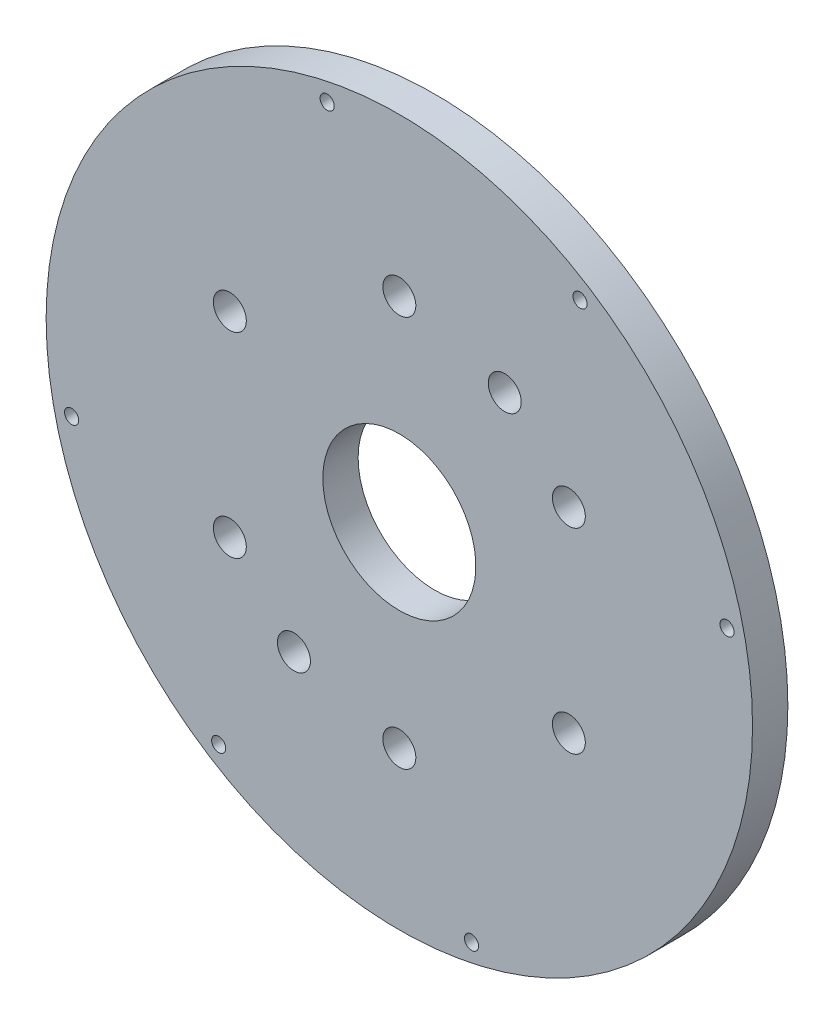
ISO-10303-21;
HEADER;
FILE_DESCRIPTION(('STEP AP214'),'2;1');
FILE_NAME('part.step','',(''),(''),'','','');
FILE_SCHEMA(('AUTOMOTIVE_DESIGN { 1 0 10303 214 1 1 1 1 }'));
ENDSEC;
DATA;
#1=APPLICATION_CONTEXT('core data for automotive mechanical design processes');
#2=APPLICATION_PROTOCOL_DEFINITION('international standard','automotive_design',2000,#1);
#3=PRODUCT_CONTEXT('',#1,'mechanical');
#4=PRODUCT('Part','Part','',(#3));
#5=PRODUCT_RELATED_PRODUCT_CATEGORY('part','',(#4));
#6=PRODUCT_DEFINITION_FORMATION('','',#4);
#7=PRODUCT_DEFINITION_CONTEXT('part definition',#1,'design');
#8=PRODUCT_DEFINITION('design','',#6,#7);
#9=PRODUCT_DEFINITION_SHAPE('','',#8);
#10=(LENGTH_UNIT() NAMED_UNIT(*) SI_UNIT(.MILLI.,.METRE.));
#11=(NAMED_UNIT(*) PLANE_ANGLE_UNIT() SI_UNIT($,.RADIAN.));
#12=(NAMED_UNIT(*) SI_UNIT($,.STERADIAN.) SOLID_ANGLE_UNIT());
#13=UNCERTAINTY_MEASURE_WITH_UNIT(LENGTH_MEASURE(1.E-05),#10,'distance_accuracy_value','');
#14=(GEOMETRIC_REPRESENTATION_CONTEXT(3) GLOBAL_UNCERTAINTY_ASSIGNED_CONTEXT((#13)) GLOBAL_UNIT_ASSIGNED_CONTEXT((#10,
#11,#12)) REPRESENTATION_CONTEXT('',''));
#15=CARTESIAN_POINT('',(0.,0.,0.));
#16=DIRECTION('',(0.,0.,1.));
#17=DIRECTION('',(1.,0.,0.));
#18=AXIS2_PLACEMENT_3D('',#15,#16,#17);
#19=CARTESIAN_POINT('',(0.,0.,-6.));
#20=DIRECTION('',(0.,0.,1.));
#21=DIRECTION('',(1.,0.,0.));
#22=AXIS2_PLACEMENT_3D('',#19,#20,#21);
#23=CYLINDRICAL_SURFACE('',#22,60.);
#24=CARTESIAN_POINT('',(0.,0.,-6.));
#25=DIRECTION('',(0.,0.,1.));
#26=DIRECTION('',(1.,0.,0.));
#27=AXIS2_PLACEMENT_3D('',#24,#25,#26);
#28=CIRCLE('',#27,60.);
#29=CARTESIAN_POINT('',(60.,0.,-6.));
#30=VERTEX_POINT('',#29);
#31=EDGE_CURVE('E10',#30,#30,#28,.T.);
#32=ORIENTED_EDGE('',*,*,#31,.T.);
#33=EDGE_LOOP('',(#32));
#34=FACE_BOUND('',#33,.T.);
#35=CARTESIAN_POINT('',(0.,0.,0.));
#36=DIRECTION('',(0.,0.,1.));
#37=DIRECTION('',(1.,0.,0.));
#38=AXIS2_PLACEMENT_3D('',#35,#36,#37);
#39=CIRCLE('',#38,60.);
#40=CARTESIAN_POINT('',(60.,0.,0.));
#41=VERTEX_POINT('',#40);
#42=EDGE_CURVE('E43',#41,#41,#39,.T.);
#43=ORIENTED_EDGE('',*,*,#42,.F.);
#44=EDGE_LOOP('',(#43));
#45=FACE_BOUND('',#44,.T.);
#46=ADVANCED_FACE('F40',(#34,#45),#23,.T.);
#47=CARTESIAN_POINT('',(0.,0.,-6.));
#48=DIRECTION('',(0.,0.,1.));
#49=DIRECTION('',(1.,0.,0.));
#50=AXIS2_PLACEMENT_3D('',#47,#48,#49);
#51=PLANE('',#50);
#52=CARTESIAN_POINT('',(55.665534128586,12.2616601722212,-6.));
#53=DIRECTION('',(0.,0.,-1.));
#54=DIRECTION('',(-1.,0.,0.));
#55=AXIS2_PLACEMENT_3D('',#52,#53,#54);
#56=CIRCLE('',#55,2.19999999999999);
#57=CARTESIAN_POINT('',(53.465534128586,12.2616601722212,-6.));
#58=VERTEX_POINT('',#57);
#59=EDGE_CURVE('E174',#58,#58,#56,.T.);
#60=ORIENTED_EDGE('',*,*,#59,.F.);
#61=EDGE_LOOP('',(#60));
#62=FACE_BOUND('',#61,.T.);
#63=CARTESIAN_POINT('',(30.691173604312,48.0317797170788,-6.));
#64=DIRECTION('',(0.,0.,-1.));
#65=DIRECTION('',(-1.,0.,0.));
#66=AXIS2_PLACEMENT_3D('',#63,#64,#65);
#67=CIRCLE('',#66,2.2);
#68=CARTESIAN_POINT('',(28.491173604312,48.0317797170788,-6.));
#69=VERTEX_POINT('',#68);
#70=EDGE_CURVE('E162',#69,#69,#67,.T.);
#71=ORIENTED_EDGE('',*,*,#70,.F.);
#72=EDGE_LOOP('',(#71));
#73=FACE_BOUND('',#72,.T.);
#74=CARTESIAN_POINT('',(-12.261660172222,55.6655341285893,-6.));
#75=DIRECTION('',(0.,0.,-1.));
#76=DIRECTION('',(-1.,0.,0.));
#77=AXIS2_PLACEMENT_3D('',#74,#75,#76);
#78=CIRCLE('',#77,2.19999999999999);
#79=CARTESIAN_POINT('',(-14.461660172222,55.6655341285893,-6.));
#80=VERTEX_POINT('',#79);
#81=EDGE_CURVE('E150',#80,#80,#78,.T.);
#82=ORIENTED_EDGE('',*,*,#81,.F.);
#83=EDGE_LOOP('',(#82));
#84=FACE_BOUND('',#83,.T.);
#85=CARTESIAN_POINT('',(-55.6655341285901,-12.2616601722186,-6.));
#86=DIRECTION('',(0.,0.,-1.));
#87=DIRECTION('',(-1.,0.,0.));
#88=AXIS2_PLACEMENT_3D('',#85,#86,#87);
#89=CIRCLE('',#88,2.19999999999999);
#90=CARTESIAN_POINT('',(-57.8655341285901,-12.2616601722186,-6.));
#91=VERTEX_POINT('',#90);
#92=EDGE_CURVE('E138',#91,#91,#89,.T.);
#93=ORIENTED_EDGE('',*,*,#92,.F.);
#94=EDGE_LOOP('',(#93));
#95=FACE_BOUND('',#94,.T.);
#96=CARTESIAN_POINT('',(-30.6911736043161,-48.0317797170762,-6.));
#97=DIRECTION('',(0.,0.,-1.));
#98=DIRECTION('',(-1.,0.,0.));
#99=AXIS2_PLACEMENT_3D('',#96,#97,#98);
#100=CIRCLE('',#99,2.19999999999999);
#101=CARTESIAN_POINT('',(-32.8911736043161,-48.0317797170762,-6.));
#102=VERTEX_POINT('',#101);
#103=EDGE_CURVE('E126',#102,#102,#100,.T.);
#104=ORIENTED_EDGE('',*,*,#103,.F.);
#105=EDGE_LOOP('',(#104));
#106=FACE_BOUND('',#105,.T.);
#107=CARTESIAN_POINT('',(12.2616601722178,-55.6655341285867,-6.));
#108=DIRECTION('',(0.,0.,-1.));
#109=DIRECTION('',(-1.,0.,0.));
#110=AXIS2_PLACEMENT_3D('',#107,#108,#109);
#111=CIRCLE('',#110,2.19999999999999);
#112=CARTESIAN_POINT('',(10.0616601722179,-55.6655341285867,-6.));
#113=VERTEX_POINT('',#112);
#114=EDGE_CURVE('E114',#113,#113,#111,.T.);
#115=ORIENTED_EDGE('',*,*,#114,.F.);
#116=EDGE_LOOP('',(#115));
#117=FACE_BOUND('',#116,.T.);
#118=CARTESIAN_POINT('',(17.9031846025153,28.018538168296,-6.));
#119=DIRECTION('',(0.,0.,1.));
#120=DIRECTION('',(1.,0.,0.));
#121=AXIS2_PLACEMENT_3D('',#118,#119,#120);
#122=CIRCLE('',#121,2.8);
#123=CARTESIAN_POINT('',(20.7031846025153,28.018538168296,-6.));
#124=VERTEX_POINT('',#123);
#125=EDGE_CURVE('E99',#124,#124,#122,.T.);
#126=ORIENTED_EDGE('',*,*,#125,.T.);
#127=EDGE_LOOP('',(#126));
#128=FACE_BOUND('',#127,.T.);
#129=CARTESIAN_POINT('',(-17.9031846025153,-28.018538168296,-6.));
#130=DIRECTION('',(0.,0.,1.));
#131=DIRECTION('',(1.,0.,0.));
#132=AXIS2_PLACEMENT_3D('',#129,#130,#131);
#133=CIRCLE('',#132,2.8);
#134=CARTESIAN_POINT('',(-15.1031846025153,-28.018538168296,-6.));
#135=VERTEX_POINT('',#134);
#136=EDGE_CURVE('E93',#135,#135,#133,.T.);
#137=ORIENTED_EDGE('',*,*,#136,.T.);
#138=EDGE_LOOP('',(#137));
#139=FACE_BOUND('',#138,.T.);
#140=CARTESIAN_POINT('',(0.,-33.25,-6.));
#141=DIRECTION('',(0.,0.,-1.));
#142=DIRECTION('',(-1.,0.,0.));
#143=AXIS2_PLACEMENT_3D('',#140,#141,#142);
#144=CIRCLE('',#143,2.8);
#145=CARTESIAN_POINT('',(-2.8,-33.25,-6.));
#146=VERTEX_POINT('',#145);
#147=EDGE_CURVE('E90',#146,#146,#144,.T.);
#148=ORIENTED_EDGE('',*,*,#147,.F.);
#149=EDGE_LOOP('',(#148));
#150=FACE_BOUND('',#149,.T.);
#151=CARTESIAN_POINT('',(28.7953446758326,-16.6249999999999,-6.));
#152=DIRECTION('',(0.,0.,-1.));
#153=DIRECTION('',(-1.,0.,0.));
#154=AXIS2_PLACEMENT_3D('',#151,#152,#153);
#155=CIRCLE('',#154,2.8);
#156=CARTESIAN_POINT('',(25.9953446758326,-16.6249999999999,-6.));
#157=VERTEX_POINT('',#156);
#158=EDGE_CURVE('E84',#157,#157,#155,.T.);
#159=ORIENTED_EDGE('',*,*,#158,.F.);
#160=EDGE_LOOP('',(#159));
#161=FACE_BOUND('',#160,.T.);
#162=CARTESIAN_POINT('',(28.7953446758325,16.6250000000001,-6.));
#163=DIRECTION('',(0.,0.,-1.));
#164=DIRECTION('',(-1.,0.,0.));
#165=AXIS2_PLACEMENT_3D('',#162,#163,#164);
#166=CIRCLE('',#165,2.8);
#167=CARTESIAN_POINT('',(25.9953446758325,16.6250000000001,-6.));
#168=VERTEX_POINT('',#167);
#169=EDGE_CURVE('E78',#168,#168,#166,.T.);
#170=ORIENTED_EDGE('',*,*,#169,.F.);
#171=EDGE_LOOP('',(#170));
#172=FACE_BOUND('',#171,.T.);
#173=CARTESIAN_POINT('',(-2.32183509033068E-13,33.25,-6.));
#174=DIRECTION('',(0.,0.,-1.));
#175=DIRECTION('',(-1.,0.,0.));
#176=AXIS2_PLACEMENT_3D('',#173,#174,#175);
#177=CIRCLE('',#176,2.8);
#178=CARTESIAN_POINT('',(-2.80000000000023,33.25,-6.));
#179=VERTEX_POINT('',#178);
#180=EDGE_CURVE('E72',#179,#179,#177,.T.);
#181=ORIENTED_EDGE('',*,*,#180,.F.);
#182=EDGE_LOOP('',(#181));
#183=FACE_BOUND('',#182,.T.);
#184=CARTESIAN_POINT('',(-28.7953446758327,16.6249999999997,-6.));
#185=DIRECTION('',(0.,0.,-1.));
#186=DIRECTION('',(-1.,0.,0.));
#187=AXIS2_PLACEMENT_3D('',#184,#185,#186);
#188=CIRCLE('',#187,2.8);
#189=CARTESIAN_POINT('',(-31.5953446758327,16.6249999999997,-6.));
#190=VERTEX_POINT('',#189);
#191=EDGE_CURVE('E66',#190,#190,#188,.T.);
#192=ORIENTED_EDGE('',*,*,#191,.F.);
#193=EDGE_LOOP('',(#192));
#194=FACE_BOUND('',#193,.T.);
#195=CARTESIAN_POINT('',(-28.7953446758324,-16.6250000000003,-6.));
#196=DIRECTION('',(0.,0.,-1.));
#197=DIRECTION('',(-1.,0.,0.));
#198=AXIS2_PLACEMENT_3D('',#195,#196,#197);
#199=CIRCLE('',#198,2.8);
#200=CARTESIAN_POINT('',(-31.5953446758324,-16.6250000000003,-6.));
#201=VERTEX_POINT('',#200);
#202=EDGE_CURVE('E60',#201,#201,#199,.T.);
#203=ORIENTED_EDGE('',*,*,#202,.F.);
#204=EDGE_LOOP('',(#203));
#205=FACE_BOUND('',#204,.T.);
#206=CARTESIAN_POINT('',(0.,0.,-6.));
#207=DIRECTION('',(0.,0.,1.));
#208=DIRECTION('',(1.,0.,0.));
#209=AXIS2_PLACEMENT_3D('',#206,#207,#208);
#210=CIRCLE('',#209,13.);
#211=CARTESIAN_POINT('',(13.,0.,-6.));
#212=VERTEX_POINT('',#211);
#213=EDGE_CURVE('E50',#212,#212,#210,.T.);
#214=ORIENTED_EDGE('',*,*,#213,.T.);
#215=EDGE_LOOP('',(#214));
#216=FACE_BOUND('',#215,.T.);
#217=ORIENTED_EDGE('',*,*,#31,.F.);
#218=EDGE_LOOP('',(#217));
#219=FACE_BOUND('',#218,.T.);
#220=ADVANCED_FACE('F180',(#62,#73,#84,#95,#106,#117,#128,#139,#150,#161,#172,#183,#194,#205,
#216,#219),#51,.F.);
#221=CARTESIAN_POINT('',(0.,0.,0.));
#222=DIRECTION('',(0.,0.,1.));
#223=DIRECTION('',(1.,0.,0.));
#224=AXIS2_PLACEMENT_3D('',#221,#222,#223);
#225=PLANE('',#224);
#226=CARTESIAN_POINT('',(55.665534128586,12.2616601722212,0.));
#227=DIRECTION('',(0.,0.,-1.));
#228=DIRECTION('',(-1.,0.,0.));
#229=AXIS2_PLACEMENT_3D('',#226,#227,#228);
#230=CIRCLE('',#229,1.2);
#231=CARTESIAN_POINT('',(54.465534128586,12.2616601722212,0.));
#232=VERTEX_POINT('',#231);
#233=EDGE_CURVE('E165',#232,#232,#230,.T.);
#234=ORIENTED_EDGE('',*,*,#233,.T.);
#235=EDGE_LOOP('',(#234));
#236=FACE_BOUND('',#235,.T.);
#237=CARTESIAN_POINT('',(30.691173604312,48.0317797170788,0.));
#238=DIRECTION('',(0.,0.,-1.));
#239=DIRECTION('',(-1.,0.,0.));
#240=AXIS2_PLACEMENT_3D('',#237,#238,#239);
#241=CIRCLE('',#240,1.2);
#242=CARTESIAN_POINT('',(29.491173604312,48.0317797170788,0.));
#243=VERTEX_POINT('',#242);
#244=EDGE_CURVE('E153',#243,#243,#241,.T.);
#245=ORIENTED_EDGE('',*,*,#244,.T.);
#246=EDGE_LOOP('',(#245));
#247=FACE_BOUND('',#246,.T.);
#248=CARTESIAN_POINT('',(-12.261660172222,55.6655341285893,0.));
#249=DIRECTION('',(0.,0.,-1.));
#250=DIRECTION('',(-1.,0.,0.));
#251=AXIS2_PLACEMENT_3D('',#248,#249,#250);
#252=CIRCLE('',#251,1.2);
#253=CARTESIAN_POINT('',(-13.461660172222,55.6655341285893,0.));
#254=VERTEX_POINT('',#253);
#255=EDGE_CURVE('E141',#254,#254,#252,.T.);
#256=ORIENTED_EDGE('',*,*,#255,.T.);
#257=EDGE_LOOP('',(#256));
#258=FACE_BOUND('',#257,.T.);
#259=CARTESIAN_POINT('',(-55.6655341285901,-12.2616601722186,0.));
#260=DIRECTION('',(0.,0.,-1.));
#261=DIRECTION('',(-1.,0.,0.));
#262=AXIS2_PLACEMENT_3D('',#259,#260,#261);
#263=CIRCLE('',#262,1.2);
#264=CARTESIAN_POINT('',(-56.8655341285901,-12.2616601722186,0.));
#265=VERTEX_POINT('',#264);
#266=EDGE_CURVE('E129',#265,#265,#263,.T.);
#267=ORIENTED_EDGE('',*,*,#266,.T.);
#268=EDGE_LOOP('',(#267));
#269=FACE_BOUND('',#268,.T.);
#270=CARTESIAN_POINT('',(-30.6911736043161,-48.0317797170762,0.));
#271=DIRECTION('',(0.,0.,-1.));
#272=DIRECTION('',(-1.,0.,0.));
#273=AXIS2_PLACEMENT_3D('',#270,#271,#272);
#274=CIRCLE('',#273,1.2);
#275=CARTESIAN_POINT('',(-31.8911736043161,-48.0317797170762,0.));
#276=VERTEX_POINT('',#275);
#277=EDGE_CURVE('E117',#276,#276,#274,.T.);
#278=ORIENTED_EDGE('',*,*,#277,.T.);
#279=EDGE_LOOP('',(#278));
#280=FACE_BOUND('',#279,.T.);
#281=CARTESIAN_POINT('',(12.2616601722178,-55.6655341285867,0.));
#282=DIRECTION('',(0.,0.,-1.));
#283=DIRECTION('',(-1.,0.,0.));
#284=AXIS2_PLACEMENT_3D('',#281,#282,#283);
#285=CIRCLE('',#284,1.2);
#286=CARTESIAN_POINT('',(11.0616601722178,-55.6655341285867,0.));
#287=VERTEX_POINT('',#286);
#288=EDGE_CURVE('E105',#287,#287,#285,.T.);
#289=ORIENTED_EDGE('',*,*,#288,.T.);
#290=EDGE_LOOP('',(#289));
#291=FACE_BOUND('',#290,.T.);
#292=CARTESIAN_POINT('',(17.9031846025153,28.018538168296,0.));
#293=DIRECTION('',(0.,0.,1.));
#294=DIRECTION('',(1.,0.,0.));
#295=AXIS2_PLACEMENT_3D('',#292,#293,#294);
#296=CIRCLE('',#295,2.8);
#297=CARTESIAN_POINT('',(20.7031846025153,28.018538168296,0.));
#298=VERTEX_POINT('',#297);
#299=EDGE_CURVE('E102',#298,#298,#296,.T.);
#300=ORIENTED_EDGE('',*,*,#299,.F.);
#301=EDGE_LOOP('',(#300));
#302=FACE_BOUND('',#301,.T.);
#303=CARTESIAN_POINT('',(-17.9031846025153,-28.018538168296,0.));
#304=DIRECTION('',(0.,0.,1.));
#305=DIRECTION('',(1.,0.,0.));
#306=AXIS2_PLACEMENT_3D('',#303,#304,#305);
#307=CIRCLE('',#306,2.8);
#308=CARTESIAN_POINT('',(-15.1031846025153,-28.018538168296,0.));
#309=VERTEX_POINT('',#308);
#310=EDGE_CURVE('E96',#309,#309,#307,.T.);
#311=ORIENTED_EDGE('',*,*,#310,.F.);
#312=EDGE_LOOP('',(#311));
#313=FACE_BOUND('',#312,.T.);
#314=CARTESIAN_POINT('',(0.,-33.25,0.));
#315=DIRECTION('',(0.,0.,-1.));
#316=DIRECTION('',(-1.,0.,0.));
#317=AXIS2_PLACEMENT_3D('',#314,#315,#316);
#318=CIRCLE('',#317,2.8);
#319=CARTESIAN_POINT('',(-2.8,-33.25,0.));
#320=VERTEX_POINT('',#319);
#321=EDGE_CURVE('E87',#320,#320,#318,.T.);
#322=ORIENTED_EDGE('',*,*,#321,.T.);
#323=EDGE_LOOP('',(#322));
#324=FACE_BOUND('',#323,.T.);
#325=CARTESIAN_POINT('',(28.7953446758326,-16.6249999999999,0.));
#326=DIRECTION('',(0.,0.,-1.));
#327=DIRECTION('',(-1.,0.,0.));
#328=AXIS2_PLACEMENT_3D('',#325,#326,#327);
#329=CIRCLE('',#328,2.8);
#330=CARTESIAN_POINT('',(25.9953446758326,-16.6249999999999,0.));
#331=VERTEX_POINT('',#330);
#332=EDGE_CURVE('E81',#331,#331,#329,.T.);
#333=ORIENTED_EDGE('',*,*,#332,.T.);
#334=EDGE_LOOP('',(#333));
#335=FACE_BOUND('',#334,.T.);
#336=CARTESIAN_POINT('',(28.7953446758325,16.6250000000001,0.));
#337=DIRECTION('',(0.,0.,-1.));
#338=DIRECTION('',(-1.,0.,0.));
#339=AXIS2_PLACEMENT_3D('',#336,#337,#338);
#340=CIRCLE('',#339,2.8);
#341=CARTESIAN_POINT('',(25.9953446758325,16.6250000000001,0.));
#342=VERTEX_POINT('',#341);
#343=EDGE_CURVE('E75',#342,#342,#340,.T.);
#344=ORIENTED_EDGE('',*,*,#343,.T.);
#345=EDGE_LOOP('',(#344));
#346=FACE_BOUND('',#345,.T.);
#347=CARTESIAN_POINT('',(-2.32183509033068E-13,33.25,0.));
#348=DIRECTION('',(0.,0.,-1.));
#349=DIRECTION('',(-1.,0.,0.));
#350=AXIS2_PLACEMENT_3D('',#347,#348,#349);
#351=CIRCLE('',#350,2.8);
#352=CARTESIAN_POINT('',(-2.80000000000023,33.25,0.));
#353=VERTEX_POINT('',#352);
#354=EDGE_CURVE('E69',#353,#353,#351,.T.);
#355=ORIENTED_EDGE('',*,*,#354,.T.);
#356=EDGE_LOOP('',(#355));
#357=FACE_BOUND('',#356,.T.);
#358=CARTESIAN_POINT('',(-28.7953446758327,16.6249999999997,0.));
#359=DIRECTION('',(0.,0.,-1.));
#360=DIRECTION('',(-1.,0.,0.));
#361=AXIS2_PLACEMENT_3D('',#358,#359,#360);
#362=CIRCLE('',#361,2.8);
#363=CARTESIAN_POINT('',(-31.5953446758327,16.6249999999997,0.));
#364=VERTEX_POINT('',#363);
#365=EDGE_CURVE('E63',#364,#364,#362,.T.);
#366=ORIENTED_EDGE('',*,*,#365,.T.);
#367=EDGE_LOOP('',(#366));
#368=FACE_BOUND('',#367,.T.);
#369=CARTESIAN_POINT('',(-28.7953446758324,-16.6250000000003,0.));
#370=DIRECTION('',(0.,0.,-1.));
#371=DIRECTION('',(-1.,0.,0.));
#372=AXIS2_PLACEMENT_3D('',#369,#370,#371);
#373=CIRCLE('',#372,2.8);
#374=CARTESIAN_POINT('',(-31.5953446758324,-16.6250000000003,0.));
#375=VERTEX_POINT('',#374);
#376=EDGE_CURVE('E57',#375,#375,#373,.T.);
#377=ORIENTED_EDGE('',*,*,#376,.T.);
#378=EDGE_LOOP('',(#377));
#379=FACE_BOUND('',#378,.T.);
#380=CARTESIAN_POINT('',(0.,0.,0.));
#381=DIRECTION('',(0.,0.,-1.));
#382=DIRECTION('',(-1.,0.,0.));
#383=AXIS2_PLACEMENT_3D('',#380,#381,#382);
#384=CIRCLE('',#383,13.);
#385=CARTESIAN_POINT('',(-13.,0.,0.));
#386=VERTEX_POINT('',#385);
#387=EDGE_CURVE('E54',#386,#386,#384,.T.);
#388=ORIENTED_EDGE('',*,*,#387,.T.);
#389=EDGE_LOOP('',(#388));
#390=FACE_BOUND('',#389,.T.);
#391=ORIENTED_EDGE('',*,*,#42,.T.);
#392=EDGE_LOOP('',(#391));
#393=FACE_BOUND('',#392,.T.);
#394=ADVANCED_FACE('F183',(#236,#247,#258,#269,#280,#291,#302,#313,#324,#335,#346,#357,#368,
#379,#390,#393),#225,.T.);
#395=CARTESIAN_POINT('',(0.,0.,0.));
#396=DIRECTION('',(0.,0.,-1.));
#397=DIRECTION('',(-1.,0.,0.));
#398=AXIS2_PLACEMENT_3D('',#395,#396,#397);
#399=CYLINDRICAL_SURFACE('',#398,13.);
#400=ORIENTED_EDGE('',*,*,#387,.F.);
#401=EDGE_LOOP('',(#400));
#402=FACE_BOUND('',#401,.T.);
#403=ORIENTED_EDGE('',*,*,#213,.F.);
#404=EDGE_LOOP('',(#403));
#405=FACE_BOUND('',#404,.T.);
#406=ADVANCED_FACE('F214',(#402,#405),#399,.F.);
#407=CARTESIAN_POINT('',(-28.7953446758324,-16.6250000000003,-6.));
#408=DIRECTION('',(0.,0.,-1.));
#409=DIRECTION('',(-1.,0.,0.));
#410=AXIS2_PLACEMENT_3D('',#407,#408,#409);
#411=CYLINDRICAL_SURFACE('',#410,2.8);
#412=ORIENTED_EDGE('',*,*,#376,.F.);
#413=EDGE_LOOP('',(#412));
#414=FACE_BOUND('',#413,.T.);
#415=ORIENTED_EDGE('',*,*,#202,.T.);
#416=EDGE_LOOP('',(#415));
#417=FACE_BOUND('',#416,.T.);
#418=ADVANCED_FACE('F216',(#414,#417),#411,.F.);
#419=CARTESIAN_POINT('',(-28.7953446758327,16.6249999999997,-6.));
#420=DIRECTION('',(0.,0.,-1.));
#421=DIRECTION('',(-1.,0.,0.));
#422=AXIS2_PLACEMENT_3D('',#419,#420,#421);
#423=CYLINDRICAL_SURFACE('',#422,2.8);
#424=ORIENTED_EDGE('',*,*,#365,.F.);
#425=EDGE_LOOP('',(#424));
#426=FACE_BOUND('',#425,.T.);
#427=ORIENTED_EDGE('',*,*,#191,.T.);
#428=EDGE_LOOP('',(#427));
#429=FACE_BOUND('',#428,.T.);
#430=ADVANCED_FACE('F223',(#426,#429),#423,.F.);
#431=CARTESIAN_POINT('',(-2.32183509033068E-13,33.25,-6.));
#432=DIRECTION('',(0.,0.,-1.));
#433=DIRECTION('',(-1.,0.,0.));
#434=AXIS2_PLACEMENT_3D('',#431,#432,#433);
#435=CYLINDRICAL_SURFACE('',#434,2.8);
#436=ORIENTED_EDGE('',*,*,#354,.F.);
#437=EDGE_LOOP('',(#436));
#438=FACE_BOUND('',#437,.T.);
#439=ORIENTED_EDGE('',*,*,#180,.T.);
#440=EDGE_LOOP('',(#439));
#441=FACE_BOUND('',#440,.T.);
#442=ADVANCED_FACE('F512',(#438,#441),#435,.F.);
#443=CARTESIAN_POINT('',(28.7953446758325,16.6250000000001,-6.));
#444=DIRECTION('',(0.,0.,-1.));
#445=DIRECTION('',(-1.,0.,0.));
#446=AXIS2_PLACEMENT_3D('',#443,#444,#445);
#447=CYLINDRICAL_SURFACE('',#446,2.8);
#448=ORIENTED_EDGE('',*,*,#343,.F.);
#449=EDGE_LOOP('',(#448));
#450=FACE_BOUND('',#449,.T.);
#451=ORIENTED_EDGE('',*,*,#169,.T.);
#452=EDGE_LOOP('',(#451));
#453=FACE_BOUND('',#452,.T.);
#454=ADVANCED_FACE('F502',(#450,#453),#447,.F.);
#455=CARTESIAN_POINT('',(28.7953446758326,-16.6249999999999,-6.));
#456=DIRECTION('',(0.,0.,-1.));
#457=DIRECTION('',(-1.,0.,0.));
#458=AXIS2_PLACEMENT_3D('',#455,#456,#457);
#459=CYLINDRICAL_SURFACE('',#458,2.8);
#460=ORIENTED_EDGE('',*,*,#332,.F.);
#461=EDGE_LOOP('',(#460));
#462=FACE_BOUND('',#461,.T.);
#463=ORIENTED_EDGE('',*,*,#158,.T.);
#464=EDGE_LOOP('',(#463));
#465=FACE_BOUND('',#464,.T.);
#466=ADVANCED_FACE('F492',(#462,#465),#459,.F.);
#467=CARTESIAN_POINT('',(0.,-33.25,-6.));
#468=DIRECTION('',(0.,0.,-1.));
#469=DIRECTION('',(-1.,0.,0.));
#470=AXIS2_PLACEMENT_3D('',#467,#468,#469);
#471=CYLINDRICAL_SURFACE('',#470,2.8);
#472=ORIENTED_EDGE('',*,*,#321,.F.);
#473=EDGE_LOOP('',(#472));
#474=FACE_BOUND('',#473,.T.);
#475=ORIENTED_EDGE('',*,*,#147,.T.);
#476=EDGE_LOOP('',(#475));
#477=FACE_BOUND('',#476,.T.);
#478=ADVANCED_FACE('F482',(#474,#477),#471,.F.);
#479=CARTESIAN_POINT('',(-17.9031846025153,-28.018538168296,0.));
#480=DIRECTION('',(0.,0.,1.));
#481=DIRECTION('',(1.,0.,0.));
#482=AXIS2_PLACEMENT_3D('',#479,#480,#481);
#483=CYLINDRICAL_SURFACE('',#482,2.8);
#484=ORIENTED_EDGE('',*,*,#136,.F.);
#485=EDGE_LOOP('',(#484));
#486=FACE_BOUND('',#485,.T.);
#487=ORIENTED_EDGE('',*,*,#310,.T.);
#488=EDGE_LOOP('',(#487));
#489=FACE_BOUND('',#488,.T.);
#490=ADVANCED_FACE('F473',(#486,#489),#483,.F.);
#491=CARTESIAN_POINT('',(17.9031846025153,28.018538168296,0.));
#492=DIRECTION('',(0.,0.,1.));
#493=DIRECTION('',(1.,0.,0.));
#494=AXIS2_PLACEMENT_3D('',#491,#492,#493);
#495=CYLINDRICAL_SURFACE('',#494,2.8);
#496=ORIENTED_EDGE('',*,*,#125,.F.);
#497=EDGE_LOOP('',(#496));
#498=FACE_BOUND('',#497,.T.);
#499=ORIENTED_EDGE('',*,*,#299,.T.);
#500=EDGE_LOOP('',(#499));
#501=FACE_BOUND('',#500,.T.);
#502=ADVANCED_FACE('F259',(#498,#501),#495,.F.);
#503=CARTESIAN_POINT('',(12.2616601722178,-55.6655341285867,-6.));
#504=DIRECTION('',(0.,0.,-1.));
#505=DIRECTION('',(-1.,0.,0.));
#506=AXIS2_PLACEMENT_3D('',#503,#504,#505);
#507=CYLINDRICAL_SURFACE('',#506,1.2);
#508=ORIENTED_EDGE('',*,*,#288,.F.);
#509=EDGE_LOOP('',(#508));
#510=FACE_BOUND('',#509,.T.);
#511=CARTESIAN_POINT('',(12.2616601722178,-55.6655341285867,-4.));
#512=DIRECTION('',(0.,0.,-1.));
#513=DIRECTION('',(-1.,0.,0.));
#514=AXIS2_PLACEMENT_3D('',#511,#512,#513);
#515=CIRCLE('',#514,1.2);
#516=CARTESIAN_POINT('',(11.0616601722178,-55.6655341285867,-4.));
#517=VERTEX_POINT('',#516);
#518=EDGE_CURVE('E108',#517,#517,#515,.T.);
#519=ORIENTED_EDGE('',*,*,#518,.T.);
#520=EDGE_LOOP('',(#519));
#521=FACE_BOUND('',#520,.T.);
#522=ADVANCED_FACE('F253',(#510,#521),#507,.F.);
#523=CARTESIAN_POINT('',(13.4616601722178,-55.6655341285867,-4.));
#524=DIRECTION('',(0.,0.,1.));
#525=DIRECTION('',(1.,0.,0.));
#526=AXIS2_PLACEMENT_3D('',#523,#524,#525);
#527=PLANE('',#526);
#528=ORIENTED_EDGE('',*,*,#518,.F.);
#529=EDGE_LOOP('',(#528));
#530=FACE_BOUND('',#529,.T.);
#531=CARTESIAN_POINT('',(12.2616601722178,-55.6655341285867,-4.));
#532=DIRECTION('',(0.,0.,-1.));
#533=DIRECTION('',(-1.,0.,0.));
#534=AXIS2_PLACEMENT_3D('',#531,#532,#533);
#535=CIRCLE('',#534,2.2);
#536=CARTESIAN_POINT('',(10.0616601722179,-55.6655341285867,-4.));
#537=VERTEX_POINT('',#536);
#538=EDGE_CURVE('E111',#537,#537,#535,.T.);
#539=ORIENTED_EDGE('',*,*,#538,.T.);
#540=EDGE_LOOP('',(#539));
#541=FACE_BOUND('',#540,.T.);
#542=ADVANCED_FACE('F258',(#530,#541),#527,.F.);
#543=CARTESIAN_POINT('',(12.2616601722178,-55.6655341285867,-6.));
#544=DIRECTION('',(0.,0.,-1.));
#545=DIRECTION('',(-1.,0.,0.));
#546=AXIS2_PLACEMENT_3D('',#543,#544,#545);
#547=CYLINDRICAL_SURFACE('',#546,2.2);
#548=ORIENTED_EDGE('',*,*,#538,.F.);
#549=EDGE_LOOP('',(#548));
#550=FACE_BOUND('',#549,.T.);
#551=ORIENTED_EDGE('',*,*,#114,.T.);
#552=EDGE_LOOP('',(#551));
#553=FACE_BOUND('',#552,.T.);
#554=ADVANCED_FACE('F272',(#550,#553),#547,.F.);
#555=CARTESIAN_POINT('',(-30.6911736043161,-48.0317797170762,-6.));
#556=DIRECTION('',(0.,0.,-1.));
#557=DIRECTION('',(-1.,0.,0.));
#558=AXIS2_PLACEMENT_3D('',#555,#556,#557);
#559=CYLINDRICAL_SURFACE('',#558,1.2);
#560=ORIENTED_EDGE('',*,*,#277,.F.);
#561=EDGE_LOOP('',(#560));
#562=FACE_BOUND('',#561,.T.);
#563=CARTESIAN_POINT('',(-30.6911736043161,-48.0317797170762,-4.));
#564=DIRECTION('',(0.,0.,-1.));
#565=DIRECTION('',(-1.,0.,0.));
#566=AXIS2_PLACEMENT_3D('',#563,#564,#565);
#567=CIRCLE('',#566,1.2);
#568=CARTESIAN_POINT('',(-31.8911736043161,-48.0317797170762,-4.));
#569=VERTEX_POINT('',#568);
#570=EDGE_CURVE('E120',#569,#569,#567,.T.);
#571=ORIENTED_EDGE('',*,*,#570,.T.);
#572=EDGE_LOOP('',(#571));
#573=FACE_BOUND('',#572,.T.);
#574=ADVANCED_FACE('F283',(#562,#573),#559,.F.);
#575=CARTESIAN_POINT('',(-29.4911736043161,-48.0317797170762,-4.));
#576=DIRECTION('',(0.,0.,1.));
#577=DIRECTION('',(1.,0.,0.));
#578=AXIS2_PLACEMENT_3D('',#575,#576,#577);
#579=PLANE('',#578);
#580=ORIENTED_EDGE('',*,*,#570,.F.);
#581=EDGE_LOOP('',(#580));
#582=FACE_BOUND('',#581,.T.);
#583=CARTESIAN_POINT('',(-30.6911736043161,-48.0317797170762,-4.));
#584=DIRECTION('',(0.,0.,-1.));
#585=DIRECTION('',(-1.,0.,0.));
#586=AXIS2_PLACEMENT_3D('',#583,#584,#585);
#587=CIRCLE('',#586,2.2);
#588=CARTESIAN_POINT('',(-32.8911736043161,-48.0317797170762,-4.));
#589=VERTEX_POINT('',#588);
#590=EDGE_CURVE('E123',#589,#589,#587,.T.);
#591=ORIENTED_EDGE('',*,*,#590,.T.);
#592=EDGE_LOOP('',(#591));
#593=FACE_BOUND('',#592,.T.);
#594=ADVANCED_FACE('F294',(#582,#593),#579,.F.);
#595=CARTESIAN_POINT('',(-30.6911736043161,-48.0317797170762,-6.));
#596=DIRECTION('',(0.,0.,-1.));
#597=DIRECTION('',(-1.,0.,0.));
#598=AXIS2_PLACEMENT_3D('',#595,#596,#597);
#599=CYLINDRICAL_SURFACE('',#598,2.2);
#600=ORIENTED_EDGE('',*,*,#590,.F.);
#601=EDGE_LOOP('',(#600));
#602=FACE_BOUND('',#601,.T.);
#603=ORIENTED_EDGE('',*,*,#103,.T.);
#604=EDGE_LOOP('',(#603));
#605=FACE_BOUND('',#604,.T.);
#606=ADVANCED_FACE('F305',(#602,#605),#599,.F.);
#607=CARTESIAN_POINT('',(-55.6655341285901,-12.2616601722186,-6.));
#608=DIRECTION('',(0.,0.,-1.));
#609=DIRECTION('',(-1.,0.,0.));
#610=AXIS2_PLACEMENT_3D('',#607,#608,#609);
#611=CYLINDRICAL_SURFACE('',#610,1.2);
#612=ORIENTED_EDGE('',*,*,#266,.F.);
#613=EDGE_LOOP('',(#612));
#614=FACE_BOUND('',#613,.T.);
#615=CARTESIAN_POINT('',(-55.6655341285901,-12.2616601722186,-4.));
#616=DIRECTION('',(0.,0.,-1.));
#617=DIRECTION('',(-1.,0.,0.));
#618=AXIS2_PLACEMENT_3D('',#615,#616,#617);
#619=CIRCLE('',#618,1.2);
#620=CARTESIAN_POINT('',(-56.8655341285901,-12.2616601722186,-4.));
#621=VERTEX_POINT('',#620);
#622=EDGE_CURVE('E132',#621,#621,#619,.T.);
#623=ORIENTED_EDGE('',*,*,#622,.T.);
#624=EDGE_LOOP('',(#623));
#625=FACE_BOUND('',#624,.T.);
#626=ADVANCED_FACE('F316',(#614,#625),#611,.F.);
#627=CARTESIAN_POINT('',(-54.4655341285901,-12.2616601722186,-4.));
#628=DIRECTION('',(0.,0.,1.));
#629=DIRECTION('',(1.,0.,0.));
#630=AXIS2_PLACEMENT_3D('',#627,#628,#629);
#631=PLANE('',#630);
#632=ORIENTED_EDGE('',*,*,#622,.F.);
#633=EDGE_LOOP('',(#632));
#634=FACE_BOUND('',#633,.T.);
#635=CARTESIAN_POINT('',(-55.6655341285901,-12.2616601722186,-4.));
#636=DIRECTION('',(0.,0.,-1.));
#637=DIRECTION('',(-1.,0.,0.));
#638=AXIS2_PLACEMENT_3D('',#635,#636,#637);
#639=CIRCLE('',#638,2.19999999999999);
#640=CARTESIAN_POINT('',(-57.8655341285901,-12.2616601722186,-4.));
#641=VERTEX_POINT('',#640);
#642=EDGE_CURVE('E135',#641,#641,#639,.T.);
#643=ORIENTED_EDGE('',*,*,#642,.T.);
#644=EDGE_LOOP('',(#643));
#645=FACE_BOUND('',#644,.T.);
#646=ADVANCED_FACE('F327',(#634,#645),#631,.F.);
#647=CARTESIAN_POINT('',(-55.6655341285901,-12.2616601722186,-6.));
#648=DIRECTION('',(0.,0.,-1.));
#649=DIRECTION('',(-1.,0.,0.));
#650=AXIS2_PLACEMENT_3D('',#647,#648,#649);
#651=CYLINDRICAL_SURFACE('',#650,2.19999999999999);
#652=ORIENTED_EDGE('',*,*,#642,.F.);
#653=EDGE_LOOP('',(#652));
#654=FACE_BOUND('',#653,.T.);
#655=ORIENTED_EDGE('',*,*,#92,.T.);
#656=EDGE_LOOP('',(#655));
#657=FACE_BOUND('',#656,.T.);
#658=ADVANCED_FACE('F338',(#654,#657),#651,.F.);
#659=CARTESIAN_POINT('',(-12.261660172222,55.6655341285893,-6.));
#660=DIRECTION('',(0.,0.,-1.));
#661=DIRECTION('',(-1.,0.,0.));
#662=AXIS2_PLACEMENT_3D('',#659,#660,#661);
#663=CYLINDRICAL_SURFACE('',#662,1.2);
#664=ORIENTED_EDGE('',*,*,#255,.F.);
#665=EDGE_LOOP('',(#664));
#666=FACE_BOUND('',#665,.T.);
#667=CARTESIAN_POINT('',(-12.261660172222,55.6655341285893,-4.));
#668=DIRECTION('',(0.,0.,-1.));
#669=DIRECTION('',(-1.,0.,0.));
#670=AXIS2_PLACEMENT_3D('',#667,#668,#669);
#671=CIRCLE('',#670,1.2);
#672=CARTESIAN_POINT('',(-13.461660172222,55.6655341285893,-4.));
#673=VERTEX_POINT('',#672);
#674=EDGE_CURVE('E144',#673,#673,#671,.T.);
#675=ORIENTED_EDGE('',*,*,#674,.T.);
#676=EDGE_LOOP('',(#675));
#677=FACE_BOUND('',#676,.T.);
#678=ADVANCED_FACE('F349',(#666,#677),#663,.F.);
#679=CARTESIAN_POINT('',(-11.061660172222,55.6655341285893,-4.));
#680=DIRECTION('',(0.,0.,1.));
#681=DIRECTION('',(1.,0.,0.));
#682=AXIS2_PLACEMENT_3D('',#679,#680,#681);
#683=PLANE('',#682);
#684=ORIENTED_EDGE('',*,*,#674,.F.);
#685=EDGE_LOOP('',(#684));
#686=FACE_BOUND('',#685,.T.);
#687=CARTESIAN_POINT('',(-12.261660172222,55.6655341285893,-4.));
#688=DIRECTION('',(0.,0.,-1.));
#689=DIRECTION('',(-1.,0.,0.));
#690=AXIS2_PLACEMENT_3D('',#687,#688,#689);
#691=CIRCLE('',#690,2.2);
#692=CARTESIAN_POINT('',(-14.461660172222,55.6655341285893,-4.));
#693=VERTEX_POINT('',#692);
#694=EDGE_CURVE('E147',#693,#693,#691,.T.);
#695=ORIENTED_EDGE('',*,*,#694,.T.);
#696=EDGE_LOOP('',(#695));
#697=FACE_BOUND('',#696,.T.);
#698=ADVANCED_FACE('F360',(#686,#697),#683,.F.);
#699=CARTESIAN_POINT('',(-12.261660172222,55.6655341285893,-6.));
#700=DIRECTION('',(0.,0.,-1.));
#701=DIRECTION('',(-1.,0.,0.));
#702=AXIS2_PLACEMENT_3D('',#699,#700,#701);
#703=CYLINDRICAL_SURFACE('',#702,2.2);
#704=ORIENTED_EDGE('',*,*,#694,.F.);
#705=EDGE_LOOP('',(#704));
#706=FACE_BOUND('',#705,.T.);
#707=ORIENTED_EDGE('',*,*,#81,.T.);
#708=EDGE_LOOP('',(#707));
#709=FACE_BOUND('',#708,.T.);
#710=ADVANCED_FACE('F371',(#706,#709),#703,.F.);
#711=CARTESIAN_POINT('',(30.691173604312,48.0317797170788,-6.));
#712=DIRECTION('',(0.,0.,-1.));
#713=DIRECTION('',(-1.,0.,0.));
#714=AXIS2_PLACEMENT_3D('',#711,#712,#713);
#715=CYLINDRICAL_SURFACE('',#714,1.2);
#716=ORIENTED_EDGE('',*,*,#244,.F.);
#717=EDGE_LOOP('',(#716));
#718=FACE_BOUND('',#717,.T.);
#719=CARTESIAN_POINT('',(30.691173604312,48.0317797170788,-4.));
#720=DIRECTION('',(0.,0.,-1.));
#721=DIRECTION('',(-1.,0.,0.));
#722=AXIS2_PLACEMENT_3D('',#719,#720,#721);
#723=CIRCLE('',#722,1.2);
#724=CARTESIAN_POINT('',(29.491173604312,48.0317797170788,-4.));
#725=VERTEX_POINT('',#724);
#726=EDGE_CURVE('E156',#725,#725,#723,.T.);
#727=ORIENTED_EDGE('',*,*,#726,.T.);
#728=EDGE_LOOP('',(#727));
#729=FACE_BOUND('',#728,.T.);
#730=ADVANCED_FACE('F382',(#718,#729),#715,.F.);
#731=CARTESIAN_POINT('',(31.891173604312,48.0317797170788,-4.));
#732=DIRECTION('',(0.,0.,1.));
#733=DIRECTION('',(1.,0.,0.));
#734=AXIS2_PLACEMENT_3D('',#731,#732,#733);
#735=PLANE('',#734);
#736=ORIENTED_EDGE('',*,*,#726,.F.);
#737=EDGE_LOOP('',(#736));
#738=FACE_BOUND('',#737,.T.);
#739=CARTESIAN_POINT('',(30.691173604312,48.0317797170788,-4.));
#740=DIRECTION('',(0.,0.,-1.));
#741=DIRECTION('',(-1.,0.,0.));
#742=AXIS2_PLACEMENT_3D('',#739,#740,#741);
#743=CIRCLE('',#742,2.2);
#744=CARTESIAN_POINT('',(28.491173604312,48.0317797170788,-4.));
#745=VERTEX_POINT('',#744);
#746=EDGE_CURVE('E159',#745,#745,#743,.T.);
#747=ORIENTED_EDGE('',*,*,#746,.T.);
#748=EDGE_LOOP('',(#747));
#749=FACE_BOUND('',#748,.T.);
#750=ADVANCED_FACE('F393',(#738,#749),#735,.F.);
#751=CARTESIAN_POINT('',(30.691173604312,48.0317797170788,-6.));
#752=DIRECTION('',(0.,0.,-1.));
#753=DIRECTION('',(-1.,0.,0.));
#754=AXIS2_PLACEMENT_3D('',#751,#752,#753);
#755=CYLINDRICAL_SURFACE('',#754,2.2);
#756=ORIENTED_EDGE('',*,*,#746,.F.);
#757=EDGE_LOOP('',(#756));
#758=FACE_BOUND('',#757,.T.);
#759=ORIENTED_EDGE('',*,*,#70,.T.);
#760=EDGE_LOOP('',(#759));
#761=FACE_BOUND('',#760,.T.);
#762=ADVANCED_FACE('F404',(#758,#761),#755,.F.);
#763=CARTESIAN_POINT('',(55.665534128586,12.2616601722212,-6.));
#764=DIRECTION('',(0.,0.,-1.));
#765=DIRECTION('',(-1.,0.,0.));
#766=AXIS2_PLACEMENT_3D('',#763,#764,#765);
#767=CYLINDRICAL_SURFACE('',#766,1.2);
#768=ORIENTED_EDGE('',*,*,#233,.F.);
#769=EDGE_LOOP('',(#768));
#770=FACE_BOUND('',#769,.T.);
#771=CARTESIAN_POINT('',(55.665534128586,12.2616601722212,-4.));
#772=DIRECTION('',(0.,0.,-1.));
#773=DIRECTION('',(-1.,0.,0.));
#774=AXIS2_PLACEMENT_3D('',#771,#772,#773);
#775=CIRCLE('',#774,1.2);
#776=CARTESIAN_POINT('',(54.465534128586,12.2616601722212,-4.));
#777=VERTEX_POINT('',#776);
#778=EDGE_CURVE('E168',#777,#777,#775,.T.);
#779=ORIENTED_EDGE('',*,*,#778,.T.);
#780=EDGE_LOOP('',(#779));
#781=FACE_BOUND('',#780,.T.);
#782=ADVANCED_FACE('F415',(#770,#781),#767,.F.);
#783=CARTESIAN_POINT('',(56.865534128586,12.2616601722212,-4.));
#784=DIRECTION('',(0.,0.,1.));
#785=DIRECTION('',(1.,0.,0.));
#786=AXIS2_PLACEMENT_3D('',#783,#784,#785);
#787=PLANE('',#786);
#788=ORIENTED_EDGE('',*,*,#778,.F.);
#789=EDGE_LOOP('',(#788));
#790=FACE_BOUND('',#789,.T.);
#791=CARTESIAN_POINT('',(55.665534128586,12.2616601722212,-4.));
#792=DIRECTION('',(0.,0.,-1.));
#793=DIRECTION('',(-1.,0.,0.));
#794=AXIS2_PLACEMENT_3D('',#791,#792,#793);
#795=CIRCLE('',#794,2.19999999999999);
#796=CARTESIAN_POINT('',(53.465534128586,12.2616601722212,-4.));
#797=VERTEX_POINT('',#796);
#798=EDGE_CURVE('E171',#797,#797,#795,.T.);
#799=ORIENTED_EDGE('',*,*,#798,.T.);
#800=EDGE_LOOP('',(#799));
#801=FACE_BOUND('',#800,.T.);
#802=ADVANCED_FACE('F426',(#790,#801),#787,.F.);
#803=CARTESIAN_POINT('',(55.665534128586,12.2616601722212,-6.));
#804=DIRECTION('',(0.,0.,-1.));
#805=DIRECTION('',(-1.,0.,0.));
#806=AXIS2_PLACEMENT_3D('',#803,#804,#805);
#807=CYLINDRICAL_SURFACE('',#806,2.19999999999999);
#808=ORIENTED_EDGE('',*,*,#798,.F.);
#809=EDGE_LOOP('',(#808));
#810=FACE_BOUND('',#809,.T.);
#811=ORIENTED_EDGE('',*,*,#59,.T.);
#812=EDGE_LOOP('',(#811));
#813=FACE_BOUND('',#812,.T.);
#814=ADVANCED_FACE('F178',(#810,#813),#807,.F.);
#815=CLOSED_SHELL('',(#46,#220,#394,#406,#418,#430,#442,#454,#466,#478,#490,#502,#522,#542,#554,
#574,#594,#606,#626,#646,#658,#678,#698,#710,#730,#750,#762,#782,#802,#814));
#816=MANIFOLD_SOLID_BREP('B2',#815);
#817=ADVANCED_BREP_SHAPE_REPRESENTATION('',(#18,#816),#14);
#818=SHAPE_DEFINITION_REPRESENTATION(#9,#817);
ENDSEC;
END-ISO-10303-21;
